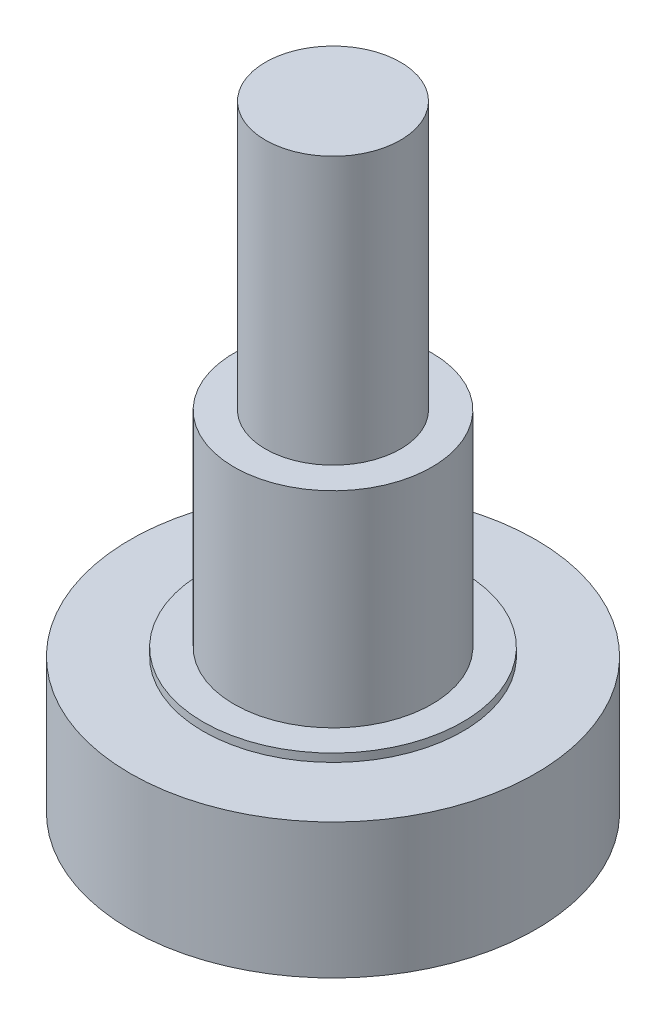
ISO-10303-21;
HEADER;
FILE_DESCRIPTION(('STEP AP214'),'2;1');
FILE_NAME('part.step','',(''),(''),'','','');
FILE_SCHEMA(('AUTOMOTIVE_DESIGN { 1 0 10303 214 1 1 1 1 }'));
ENDSEC;
DATA;
#1=APPLICATION_CONTEXT('core data for automotive mechanical design processes');
#2=APPLICATION_PROTOCOL_DEFINITION('international standard','automotive_design',2000,#1);
#3=PRODUCT_CONTEXT('',#1,'mechanical');
#4=PRODUCT('Part','Part','',(#3));
#5=PRODUCT_RELATED_PRODUCT_CATEGORY('part','',(#4));
#6=PRODUCT_DEFINITION_FORMATION('','',#4);
#7=PRODUCT_DEFINITION_CONTEXT('part definition',#1,'design');
#8=PRODUCT_DEFINITION('design','',#6,#7);
#9=PRODUCT_DEFINITION_SHAPE('','',#8);
#10=(LENGTH_UNIT() NAMED_UNIT(*) SI_UNIT(.MILLI.,.METRE.));
#11=(NAMED_UNIT(*) PLANE_ANGLE_UNIT() SI_UNIT($,.RADIAN.));
#12=(NAMED_UNIT(*) SI_UNIT($,.STERADIAN.) SOLID_ANGLE_UNIT());
#13=UNCERTAINTY_MEASURE_WITH_UNIT(LENGTH_MEASURE(1.E-05),#10,'distance_accuracy_value','');
#14=(GEOMETRIC_REPRESENTATION_CONTEXT(3) GLOBAL_UNCERTAINTY_ASSIGNED_CONTEXT((#13)) GLOBAL_UNIT_ASSIGNED_CONTEXT((#10,
#11,#12)) REPRESENTATION_CONTEXT('',''));
#15=CARTESIAN_POINT('',(0.,0.,0.));
#16=DIRECTION('',(0.,0.,1.));
#17=DIRECTION('',(1.,0.,0.));
#18=AXIS2_PLACEMENT_3D('',#15,#16,#17);
#19=CARTESIAN_POINT('',(0.,0.,0.));
#20=DIRECTION('',(0.,-1.,0.));
#21=DIRECTION('',(0.,0.,-1.));
#22=AXIS2_PLACEMENT_3D('',#19,#20,#21);
#23=PLANE('',#22);
#24=CARTESIAN_POINT('',(0.,0.,0.));
#25=DIRECTION('',(0.,1.,0.));
#26=DIRECTION('',(0.,0.,1.));
#27=AXIS2_PLACEMENT_3D('',#24,#25,#26);
#28=CIRCLE('',#27,9.525);
#29=CARTESIAN_POINT('',(0.,0.,9.525));
#30=VERTEX_POINT('',#29);
#31=EDGE_CURVE('E10',#30,#30,#28,.T.);
#32=ORIENTED_EDGE('',*,*,#31,.F.);
#33=EDGE_LOOP('',(#32));
#34=FACE_BOUND('',#33,.T.);
#35=ADVANCED_FACE('F33',(#34),#23,.T.);
#36=CARTESIAN_POINT('',(0.,0.,0.));
#37=DIRECTION('',(0.,1.,0.));
#38=DIRECTION('',(0.,0.,1.));
#39=AXIS2_PLACEMENT_3D('',#36,#37,#38);
#40=CYLINDRICAL_SURFACE('',#39,9.525);
#41=ORIENTED_EDGE('',*,*,#31,.T.);
#42=EDGE_LOOP('',(#41));
#43=FACE_BOUND('',#42,.T.);
#44=CARTESIAN_POINT('',(0.,6.35,0.));
#45=DIRECTION('',(0.,1.,0.));
#46=DIRECTION('',(0.,0.,1.));
#47=AXIS2_PLACEMENT_3D('',#44,#45,#46);
#48=CIRCLE('',#47,9.525);
#49=CARTESIAN_POINT('',(0.,6.35,9.525));
#50=VERTEX_POINT('',#49);
#51=EDGE_CURVE('E39',#50,#50,#48,.T.);
#52=ORIENTED_EDGE('',*,*,#51,.F.);
#53=EDGE_LOOP('',(#52));
#54=FACE_BOUND('',#53,.T.);
#55=ADVANCED_FACE('F81',(#43,#54),#40,.T.);
#56=CARTESIAN_POINT('',(-9.525,6.35,0.));
#57=DIRECTION('',(0.,1.,0.));
#58=DIRECTION('',(0.,0.,1.));
#59=AXIS2_PLACEMENT_3D('',#56,#57,#58);
#60=PLANE('',#59);
#61=ORIENTED_EDGE('',*,*,#51,.T.);
#62=EDGE_LOOP('',(#61));
#63=FACE_BOUND('',#62,.T.);
#64=CARTESIAN_POINT('',(0.,6.35,0.));
#65=DIRECTION('',(0.,1.,0.));
#66=DIRECTION('',(0.,0.,1.));
#67=AXIS2_PLACEMENT_3D('',#64,#65,#66);
#68=CIRCLE('',#67,6.096);
#69=CARTESIAN_POINT('',(0.,6.35,6.096));
#70=VERTEX_POINT('',#69);
#71=EDGE_CURVE('E43',#70,#70,#68,.T.);
#72=ORIENTED_EDGE('',*,*,#71,.F.);
#73=EDGE_LOOP('',(#72));
#74=FACE_BOUND('',#73,.T.);
#75=ADVANCED_FACE('F86',(#63,#74),#60,.T.);
#76=CARTESIAN_POINT('',(0.,0.,0.));
#77=DIRECTION('',(0.,1.,0.));
#78=DIRECTION('',(0.,0.,1.));
#79=AXIS2_PLACEMENT_3D('',#76,#77,#78);
#80=CYLINDRICAL_SURFACE('',#79,6.096);
#81=ORIENTED_EDGE('',*,*,#71,.T.);
#82=EDGE_LOOP('',(#81));
#83=FACE_BOUND('',#82,.T.);
#84=CARTESIAN_POINT('',(0.,6.731,0.));
#85=DIRECTION('',(0.,1.,0.));
#86=DIRECTION('',(0.,0.,1.));
#87=AXIS2_PLACEMENT_3D('',#84,#85,#86);
#88=CIRCLE('',#87,6.096);
#89=CARTESIAN_POINT('',(0.,6.731,6.096));
#90=VERTEX_POINT('',#89);
#91=EDGE_CURVE('E47',#90,#90,#88,.T.);
#92=ORIENTED_EDGE('',*,*,#91,.F.);
#93=EDGE_LOOP('',(#92));
#94=FACE_BOUND('',#93,.T.);
#95=ADVANCED_FACE('F90',(#83,#94),#80,.T.);
#96=CARTESIAN_POINT('',(-6.096,6.731,0.));
#97=DIRECTION('',(0.,1.,0.));
#98=DIRECTION('',(0.,0.,1.));
#99=AXIS2_PLACEMENT_3D('',#96,#97,#98);
#100=PLANE('',#99);
#101=ORIENTED_EDGE('',*,*,#91,.T.);
#102=EDGE_LOOP('',(#101));
#103=FACE_BOUND('',#102,.T.);
#104=CARTESIAN_POINT('',(0.,6.731,0.));
#105=DIRECTION('',(0.,1.,0.));
#106=DIRECTION('',(0.,0.,1.));
#107=AXIS2_PLACEMENT_3D('',#104,#105,#106);
#108=CIRCLE('',#107,4.6482);
#109=CARTESIAN_POINT('',(0.,6.731,4.6482));
#110=VERTEX_POINT('',#109);
#111=EDGE_CURVE('E52',#110,#110,#108,.T.);
#112=ORIENTED_EDGE('',*,*,#111,.F.);
#113=EDGE_LOOP('',(#112));
#114=FACE_BOUND('',#113,.T.);
#115=ADVANCED_FACE('F96',(#103,#114),#100,.T.);
#116=CARTESIAN_POINT('',(0.,0.,0.));
#117=DIRECTION('',(0.,1.,0.));
#118=DIRECTION('',(0.,0.,1.));
#119=AXIS2_PLACEMENT_3D('',#116,#117,#118);
#120=CYLINDRICAL_SURFACE('',#119,4.6482);
#121=ORIENTED_EDGE('',*,*,#111,.T.);
#122=EDGE_LOOP('',(#121));
#123=FACE_BOUND('',#122,.T.);
#124=CARTESIAN_POINT('',(0.,16.383,0.));
#125=DIRECTION('',(0.,1.,0.));
#126=DIRECTION('',(0.,0.,1.));
#127=AXIS2_PLACEMENT_3D('',#124,#125,#126);
#128=CIRCLE('',#127,4.6482);
#129=CARTESIAN_POINT('',(0.,16.383,4.6482));
#130=VERTEX_POINT('',#129);
#131=EDGE_CURVE('E55',#130,#130,#128,.T.);
#132=ORIENTED_EDGE('',*,*,#131,.F.);
#133=EDGE_LOOP('',(#132));
#134=FACE_BOUND('',#133,.T.);
#135=ADVANCED_FACE('F77',(#123,#134),#120,.T.);
#136=CARTESIAN_POINT('',(-4.6482,16.383,0.));
#137=DIRECTION('',(0.,1.,0.));
#138=DIRECTION('',(0.,0.,1.));
#139=AXIS2_PLACEMENT_3D('',#136,#137,#138);
#140=PLANE('',#139);
#141=ORIENTED_EDGE('',*,*,#131,.T.);
#142=EDGE_LOOP('',(#141));
#143=FACE_BOUND('',#142,.T.);
#144=CARTESIAN_POINT('',(0.,16.383,0.));
#145=DIRECTION('',(0.,1.,0.));
#146=DIRECTION('',(0.,0.,1.));
#147=AXIS2_PLACEMENT_3D('',#144,#145,#146);
#148=CIRCLE('',#147,3.175);
#149=CARTESIAN_POINT('',(0.,16.383,3.175));
#150=VERTEX_POINT('',#149);
#151=EDGE_CURVE('E58',#150,#150,#148,.T.);
#152=ORIENTED_EDGE('',*,*,#151,.F.);
#153=EDGE_LOOP('',(#152));
#154=FACE_BOUND('',#153,.T.);
#155=ADVANCED_FACE('F69',(#143,#154),#140,.T.);
#156=CARTESIAN_POINT('',(0.,0.,0.));
#157=DIRECTION('',(0.,1.,0.));
#158=DIRECTION('',(0.,0.,1.));
#159=AXIS2_PLACEMENT_3D('',#156,#157,#158);
#160=CYLINDRICAL_SURFACE('',#159,3.175);
#161=ORIENTED_EDGE('',*,*,#151,.T.);
#162=EDGE_LOOP('',(#161));
#163=FACE_BOUND('',#162,.T.);
#164=CARTESIAN_POINT('',(0.,28.956,0.));
#165=DIRECTION('',(0.,1.,0.));
#166=DIRECTION('',(0.,0.,1.));
#167=AXIS2_PLACEMENT_3D('',#164,#165,#166);
#168=CIRCLE('',#167,3.175);
#169=CARTESIAN_POINT('',(0.,28.956,3.175));
#170=VERTEX_POINT('',#169);
#171=EDGE_CURVE('E61',#170,#170,#168,.T.);
#172=ORIENTED_EDGE('',*,*,#171,.F.);
#173=EDGE_LOOP('',(#172));
#174=FACE_BOUND('',#173,.T.);
#175=ADVANCED_FACE('F67',(#163,#174),#160,.T.);
#176=CARTESIAN_POINT('',(-3.175,28.956,0.));
#177=DIRECTION('',(0.,1.,0.));
#178=DIRECTION('',(0.,0.,1.));
#179=AXIS2_PLACEMENT_3D('',#176,#177,#178);
#180=PLANE('',#179);
#181=ORIENTED_EDGE('',*,*,#171,.T.);
#182=EDGE_LOOP('',(#181));
#183=FACE_BOUND('',#182,.T.);
#184=ADVANCED_FACE('F65',(#183),#180,.T.);
#185=CLOSED_SHELL('',(#35,#55,#75,#95,#115,#135,#155,#175,#184));
#186=MANIFOLD_SOLID_BREP('B2',#185);
#187=ADVANCED_BREP_SHAPE_REPRESENTATION('',(#18,#186),#14);
#188=SHAPE_DEFINITION_REPRESENTATION(#9,#187);
ENDSEC;
END-ISO-10303-21;
